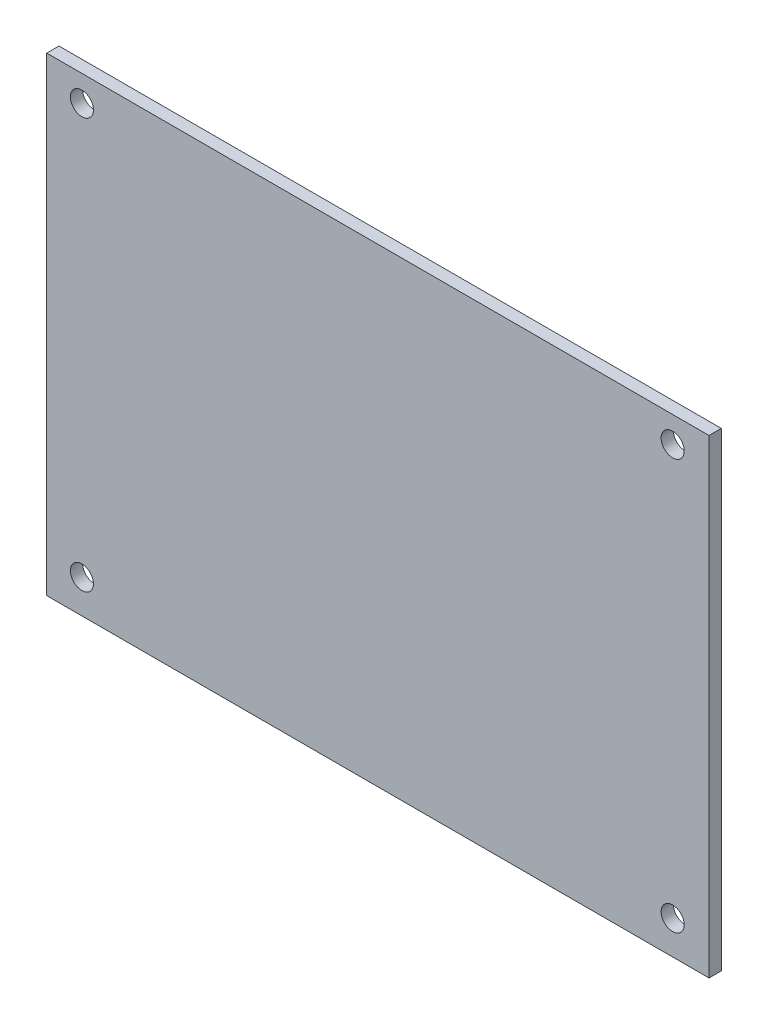
ISO-10303-21;
HEADER;
FILE_DESCRIPTION(('STEP AP214'),'2;1');
FILE_NAME('part.step','',(''),(''),'','','');
FILE_SCHEMA(('AUTOMOTIVE_DESIGN { 1 0 10303 214 1 1 1 1 }'));
ENDSEC;
DATA;
#1=APPLICATION_CONTEXT('core data for automotive mechanical design processes');
#2=APPLICATION_PROTOCOL_DEFINITION('international standard','automotive_design',2000,#1);
#3=PRODUCT_CONTEXT('',#1,'mechanical');
#4=PRODUCT('Part','Part','',(#3));
#5=PRODUCT_RELATED_PRODUCT_CATEGORY('part','',(#4));
#6=PRODUCT_DEFINITION_FORMATION('','',#4);
#7=PRODUCT_DEFINITION_CONTEXT('part definition',#1,'design');
#8=PRODUCT_DEFINITION('design','',#6,#7);
#9=PRODUCT_DEFINITION_SHAPE('','',#8);
#10=(LENGTH_UNIT() NAMED_UNIT(*) SI_UNIT(.MILLI.,.METRE.));
#11=(NAMED_UNIT(*) PLANE_ANGLE_UNIT() SI_UNIT($,.RADIAN.));
#12=(NAMED_UNIT(*) SI_UNIT($,.STERADIAN.) SOLID_ANGLE_UNIT());
#13=UNCERTAINTY_MEASURE_WITH_UNIT(LENGTH_MEASURE(1.E-05),#10,'distance_accuracy_value','');
#14=(GEOMETRIC_REPRESENTATION_CONTEXT(3) GLOBAL_UNCERTAINTY_ASSIGNED_CONTEXT((#13)) GLOBAL_UNIT_ASSIGNED_CONTEXT((#10,
#11,#12)) REPRESENTATION_CONTEXT('',''));
#15=CARTESIAN_POINT('',(0.,0.,0.));
#16=DIRECTION('',(0.,0.,1.));
#17=DIRECTION('',(1.,0.,0.));
#18=AXIS2_PLACEMENT_3D('',#15,#16,#17);
#19=CARTESIAN_POINT('',(45.88,32.55,1.7));
#20=DIRECTION('',(-1.,0.,0.));
#21=DIRECTION('',(0.,-1.,0.));
#22=AXIS2_PLACEMENT_3D('',#19,#20,#21);
#23=PLANE('',#22);
#24=DIRECTION('',(0.,1.,0.));
#25=VECTOR('',#24,1.);
#26=CARTESIAN_POINT('',(45.88,32.55,0.));
#27=LINE('',#26,#25);
#28=CARTESIAN_POINT('',(45.88,-32.55,0.));
#29=VERTEX_POINT('',#28);
#30=CARTESIAN_POINT('',(45.88,32.55,0.));
#31=VERTEX_POINT('',#30);
#32=EDGE_CURVE('E97',#29,#31,#27,.T.);
#33=ORIENTED_EDGE('',*,*,#32,.T.);
#34=DIRECTION('',(0.,0.,-1.));
#35=VECTOR('',#34,1.);
#36=CARTESIAN_POINT('',(45.88,32.55,1.7));
#37=LINE('',#36,#35);
#38=CARTESIAN_POINT('',(45.88,32.55,1.7));
#39=VERTEX_POINT('',#38);
#40=EDGE_CURVE('E11',#39,#31,#37,.T.);
#41=ORIENTED_EDGE('',*,*,#40,.F.);
#42=DIRECTION('',(0.,1.,0.));
#43=VECTOR('',#42,1.);
#44=CARTESIAN_POINT('',(45.88,32.55,1.7));
#45=LINE('',#44,#43);
#46=CARTESIAN_POINT('',(45.88,-32.55,1.7));
#47=VERTEX_POINT('',#46);
#48=EDGE_CURVE('E84',#47,#39,#45,.T.);
#49=ORIENTED_EDGE('',*,*,#48,.F.);
#50=DIRECTION('',(0.,0.,-1.));
#51=VECTOR('',#50,1.);
#52=CARTESIAN_POINT('',(45.88,-32.55,1.7));
#53=LINE('',#52,#51);
#54=EDGE_CURVE('E93',#47,#29,#53,.T.);
#55=ORIENTED_EDGE('',*,*,#54,.T.);
#56=EDGE_LOOP('',(#33,#41,#49,#55));
#57=FACE_BOUND('',#56,.T.);
#58=ADVANCED_FACE('F32',(#57),#23,.F.);
#59=CARTESIAN_POINT('',(-45.88,32.55,1.7));
#60=DIRECTION('',(0.,-1.,0.));
#61=DIRECTION('',(0.,0.,-1.));
#62=AXIS2_PLACEMENT_3D('',#59,#60,#61);
#63=PLANE('',#62);
#64=DIRECTION('',(-1.,0.,0.));
#65=VECTOR('',#64,1.);
#66=CARTESIAN_POINT('',(-45.88,32.55,0.));
#67=LINE('',#66,#65);
#68=CARTESIAN_POINT('',(-45.88,32.55,0.));
#69=VERTEX_POINT('',#68);
#70=EDGE_CURVE('E88',#31,#69,#67,.T.);
#71=ORIENTED_EDGE('',*,*,#70,.T.);
#72=DIRECTION('',(0.,0.,-1.));
#73=VECTOR('',#72,1.);
#74=CARTESIAN_POINT('',(-45.88,32.55,1.7));
#75=LINE('',#74,#73);
#76=CARTESIAN_POINT('',(-45.88,32.55,1.7));
#77=VERTEX_POINT('',#76);
#78=EDGE_CURVE('E41',#77,#69,#75,.T.);
#79=ORIENTED_EDGE('',*,*,#78,.F.);
#80=DIRECTION('',(-1.,0.,0.));
#81=VECTOR('',#80,1.);
#82=CARTESIAN_POINT('',(-45.88,32.55,1.7));
#83=LINE('',#82,#81);
#84=EDGE_CURVE('E79',#39,#77,#83,.T.);
#85=ORIENTED_EDGE('',*,*,#84,.F.);
#86=ORIENTED_EDGE('',*,*,#40,.T.);
#87=EDGE_LOOP('',(#71,#79,#85,#86));
#88=FACE_BOUND('',#87,.T.);
#89=ADVANCED_FACE('F87',(#88),#63,.F.);
#90=CARTESIAN_POINT('',(-45.88,32.55,1.7));
#91=DIRECTION('',(1.,0.,0.));
#92=DIRECTION('',(0.,1.,0.));
#93=AXIS2_PLACEMENT_3D('',#90,#91,#92);
#94=PLANE('',#93);
#95=DIRECTION('',(0.,-1.,0.));
#96=VECTOR('',#95,1.);
#97=CARTESIAN_POINT('',(-45.88,32.55,0.));
#98=LINE('',#97,#96);
#99=CARTESIAN_POINT('',(-45.88,-32.55,0.));
#100=VERTEX_POINT('',#99);
#101=EDGE_CURVE('E66',#69,#100,#98,.T.);
#102=ORIENTED_EDGE('',*,*,#101,.T.);
#103=DIRECTION('',(0.,0.,-1.));
#104=VECTOR('',#103,1.);
#105=CARTESIAN_POINT('',(-45.88,-32.55,1.7));
#106=LINE('',#105,#104);
#107=CARTESIAN_POINT('',(-45.88,-32.55,1.7));
#108=VERTEX_POINT('',#107);
#109=EDGE_CURVE('E89',#108,#100,#106,.T.);
#110=ORIENTED_EDGE('',*,*,#109,.F.);
#111=DIRECTION('',(0.,-1.,0.));
#112=VECTOR('',#111,1.);
#113=CARTESIAN_POINT('',(-45.88,32.55,1.7));
#114=LINE('',#113,#112);
#115=EDGE_CURVE('E82',#77,#108,#114,.T.);
#116=ORIENTED_EDGE('',*,*,#115,.F.);
#117=ORIENTED_EDGE('',*,*,#78,.T.);
#118=EDGE_LOOP('',(#102,#110,#116,#117));
#119=FACE_BOUND('',#118,.T.);
#120=ADVANCED_FACE('F91',(#119),#94,.F.);
#121=CARTESIAN_POINT('',(-45.88,-32.55,1.7));
#122=DIRECTION('',(0.,1.,0.));
#123=DIRECTION('',(0.,0.,1.));
#124=AXIS2_PLACEMENT_3D('',#121,#122,#123);
#125=PLANE('',#124);
#126=DIRECTION('',(1.,0.,0.));
#127=VECTOR('',#126,1.);
#128=CARTESIAN_POINT('',(-45.88,-32.55,0.));
#129=LINE('',#128,#127);
#130=EDGE_CURVE('E72',#100,#29,#129,.T.);
#131=ORIENTED_EDGE('',*,*,#130,.T.);
#132=ORIENTED_EDGE('',*,*,#54,.F.);
#133=DIRECTION('',(1.,0.,0.));
#134=VECTOR('',#133,1.);
#135=CARTESIAN_POINT('',(-45.88,-32.55,1.7));
#136=LINE('',#135,#134);
#137=EDGE_CURVE('E49',#108,#47,#136,.T.);
#138=ORIENTED_EDGE('',*,*,#137,.F.);
#139=ORIENTED_EDGE('',*,*,#109,.T.);
#140=EDGE_LOOP('',(#131,#132,#138,#139));
#141=FACE_BOUND('',#140,.T.);
#142=ADVANCED_FACE('F105',(#141),#125,.F.);
#143=CARTESIAN_POINT('',(0.,0.,1.7));
#144=DIRECTION('',(0.,0.,1.));
#145=DIRECTION('',(1.,0.,0.));
#146=AXIS2_PLACEMENT_3D('',#143,#144,#145);
#147=PLANE('',#146);
#148=CARTESIAN_POINT('',(-41.005,28.945,1.7));
#149=DIRECTION('',(0.,0.,1.));
#150=DIRECTION('',(1.,0.,0.));
#151=AXIS2_PLACEMENT_3D('',#148,#149,#150);
#152=CIRCLE('',#151,1.59999999999999);
#153=CARTESIAN_POINT('',(-39.405,28.945,1.7));
#154=VERTEX_POINT('',#153);
#155=EDGE_CURVE('E128',#154,#154,#152,.T.);
#156=ORIENTED_EDGE('',*,*,#155,.F.);
#157=EDGE_LOOP('',(#156));
#158=FACE_BOUND('',#157,.T.);
#159=CARTESIAN_POINT('',(40.845,28.945,1.7));
#160=DIRECTION('',(0.,0.,1.));
#161=DIRECTION('',(1.,0.,0.));
#162=AXIS2_PLACEMENT_3D('',#159,#160,#161);
#163=CIRCLE('',#162,1.59999999999999);
#164=CARTESIAN_POINT('',(42.445,28.945,1.7));
#165=VERTEX_POINT('',#164);
#166=EDGE_CURVE('E122',#165,#165,#163,.T.);
#167=ORIENTED_EDGE('',*,*,#166,.F.);
#168=EDGE_LOOP('',(#167));
#169=FACE_BOUND('',#168,.T.);
#170=CARTESIAN_POINT('',(40.845,-27.905,1.7));
#171=DIRECTION('',(0.,0.,1.));
#172=DIRECTION('',(1.,0.,0.));
#173=AXIS2_PLACEMENT_3D('',#170,#171,#172);
#174=CIRCLE('',#173,1.59999999999999);
#175=CARTESIAN_POINT('',(42.445,-27.905,1.7));
#176=VERTEX_POINT('',#175);
#177=EDGE_CURVE('E119',#176,#176,#174,.T.);
#178=ORIENTED_EDGE('',*,*,#177,.F.);
#179=EDGE_LOOP('',(#178));
#180=FACE_BOUND('',#179,.T.);
#181=CARTESIAN_POINT('',(-41.005,-27.905,1.7));
#182=DIRECTION('',(0.,0.,1.));
#183=DIRECTION('',(1.,0.,0.));
#184=AXIS2_PLACEMENT_3D('',#181,#182,#183);
#185=CIRCLE('',#184,1.59999999999999);
#186=CARTESIAN_POINT('',(-39.405,-27.905,1.7));
#187=VERTEX_POINT('',#186);
#188=EDGE_CURVE('E113',#187,#187,#185,.T.);
#189=ORIENTED_EDGE('',*,*,#188,.F.);
#190=EDGE_LOOP('',(#189));
#191=FACE_BOUND('',#190,.T.);
#192=ORIENTED_EDGE('',*,*,#48,.T.);
#193=ORIENTED_EDGE('',*,*,#84,.T.);
#194=ORIENTED_EDGE('',*,*,#115,.T.);
#195=ORIENTED_EDGE('',*,*,#137,.T.);
#196=EDGE_LOOP('',(#192,#193,#194,#195));
#197=FACE_BOUND('',#196,.T.);
#198=ADVANCED_FACE('F80',(#158,#169,#180,#191,#197),#147,.T.);
#199=CARTESIAN_POINT('',(0.,0.,0.));
#200=DIRECTION('',(0.,0.,1.));
#201=DIRECTION('',(1.,0.,0.));
#202=AXIS2_PLACEMENT_3D('',#199,#200,#201);
#203=PLANE('',#202);
#204=CARTESIAN_POINT('',(-41.005,28.945,0.));
#205=DIRECTION('',(0.,0.,1.));
#206=DIRECTION('',(1.,0.,0.));
#207=AXIS2_PLACEMENT_3D('',#204,#205,#206);
#208=CIRCLE('',#207,1.59999999999999);
#209=CARTESIAN_POINT('',(-39.405,28.945,0.));
#210=VERTEX_POINT('',#209);
#211=EDGE_CURVE('E125',#210,#210,#208,.T.);
#212=ORIENTED_EDGE('',*,*,#211,.T.);
#213=EDGE_LOOP('',(#212));
#214=FACE_BOUND('',#213,.T.);
#215=CARTESIAN_POINT('',(40.845,28.945,0.));
#216=DIRECTION('',(0.,0.,1.));
#217=DIRECTION('',(1.,0.,0.));
#218=AXIS2_PLACEMENT_3D('',#215,#216,#217);
#219=CIRCLE('',#218,1.59999999999999);
#220=CARTESIAN_POINT('',(42.445,28.945,0.));
#221=VERTEX_POINT('',#220);
#222=EDGE_CURVE('E35',#221,#221,#219,.T.);
#223=ORIENTED_EDGE('',*,*,#222,.T.);
#224=EDGE_LOOP('',(#223));
#225=FACE_BOUND('',#224,.T.);
#226=CARTESIAN_POINT('',(40.845,-27.905,0.));
#227=DIRECTION('',(0.,0.,1.));
#228=DIRECTION('',(1.,0.,0.));
#229=AXIS2_PLACEMENT_3D('',#226,#227,#228);
#230=CIRCLE('',#229,1.59999999999999);
#231=CARTESIAN_POINT('',(42.445,-27.905,0.));
#232=VERTEX_POINT('',#231);
#233=EDGE_CURVE('E116',#232,#232,#230,.T.);
#234=ORIENTED_EDGE('',*,*,#233,.T.);
#235=EDGE_LOOP('',(#234));
#236=FACE_BOUND('',#235,.T.);
#237=CARTESIAN_POINT('',(-41.005,-27.905,0.));
#238=DIRECTION('',(0.,0.,1.));
#239=DIRECTION('',(1.,0.,0.));
#240=AXIS2_PLACEMENT_3D('',#237,#238,#239);
#241=CIRCLE('',#240,1.59999999999999);
#242=CARTESIAN_POINT('',(-39.405,-27.905,0.));
#243=VERTEX_POINT('',#242);
#244=EDGE_CURVE('E100',#243,#243,#241,.T.);
#245=ORIENTED_EDGE('',*,*,#244,.T.);
#246=EDGE_LOOP('',(#245));
#247=FACE_BOUND('',#246,.T.);
#248=ORIENTED_EDGE('',*,*,#32,.F.);
#249=ORIENTED_EDGE('',*,*,#130,.F.);
#250=ORIENTED_EDGE('',*,*,#101,.F.);
#251=ORIENTED_EDGE('',*,*,#70,.F.);
#252=EDGE_LOOP('',(#248,#249,#250,#251));
#253=FACE_BOUND('',#252,.T.);
#254=ADVANCED_FACE('F108',(#214,#225,#236,#247,#253),#203,.F.);
#255=CARTESIAN_POINT('',(-41.005,-27.905,1.7));
#256=DIRECTION('',(0.,0.,1.));
#257=DIRECTION('',(1.,0.,0.));
#258=AXIS2_PLACEMENT_3D('',#255,#256,#257);
#259=CYLINDRICAL_SURFACE('',#258,1.59999999999999);
#260=ORIENTED_EDGE('',*,*,#188,.T.);
#261=EDGE_LOOP('',(#260));
#262=FACE_BOUND('',#261,.T.);
#263=ORIENTED_EDGE('',*,*,#244,.F.);
#264=EDGE_LOOP('',(#263));
#265=FACE_BOUND('',#264,.T.);
#266=ADVANCED_FACE('F144',(#262,#265),#259,.F.);
#267=CARTESIAN_POINT('',(40.845,-27.905,1.7));
#268=DIRECTION('',(0.,0.,1.));
#269=DIRECTION('',(1.,0.,0.));
#270=AXIS2_PLACEMENT_3D('',#267,#268,#269);
#271=CYLINDRICAL_SURFACE('',#270,1.59999999999999);
#272=ORIENTED_EDGE('',*,*,#177,.T.);
#273=EDGE_LOOP('',(#272));
#274=FACE_BOUND('',#273,.T.);
#275=ORIENTED_EDGE('',*,*,#233,.F.);
#276=EDGE_LOOP('',(#275));
#277=FACE_BOUND('',#276,.T.);
#278=ADVANCED_FACE('F147',(#274,#277),#271,.F.);
#279=CARTESIAN_POINT('',(40.845,28.945,1.7));
#280=DIRECTION('',(0.,0.,1.));
#281=DIRECTION('',(1.,0.,0.));
#282=AXIS2_PLACEMENT_3D('',#279,#280,#281);
#283=CYLINDRICAL_SURFACE('',#282,1.59999999999999);
#284=ORIENTED_EDGE('',*,*,#166,.T.);
#285=EDGE_LOOP('',(#284));
#286=FACE_BOUND('',#285,.T.);
#287=ORIENTED_EDGE('',*,*,#222,.F.);
#288=EDGE_LOOP('',(#287));
#289=FACE_BOUND('',#288,.T.);
#290=ADVANCED_FACE('F194',(#286,#289),#283,.F.);
#291=CARTESIAN_POINT('',(-41.005,28.945,1.7));
#292=DIRECTION('',(0.,0.,1.));
#293=DIRECTION('',(1.,0.,0.));
#294=AXIS2_PLACEMENT_3D('',#291,#292,#293);
#295=CYLINDRICAL_SURFACE('',#294,1.59999999999999);
#296=ORIENTED_EDGE('',*,*,#155,.T.);
#297=EDGE_LOOP('',(#296));
#298=FACE_BOUND('',#297,.T.);
#299=ORIENTED_EDGE('',*,*,#211,.F.);
#300=EDGE_LOOP('',(#299));
#301=FACE_BOUND('',#300,.T.);
#302=ADVANCED_FACE('F132',(#298,#301),#295,.F.);
#303=CLOSED_SHELL('',(#58,#89,#120,#142,#198,#254,#266,#278,#290,#302));
#304=MANIFOLD_SOLID_BREP('B2',#303);
#305=ADVANCED_BREP_SHAPE_REPRESENTATION('',(#18,#304),#14);
#306=SHAPE_DEFINITION_REPRESENTATION(#9,#305);
ENDSEC;
END-ISO-10303-21;
